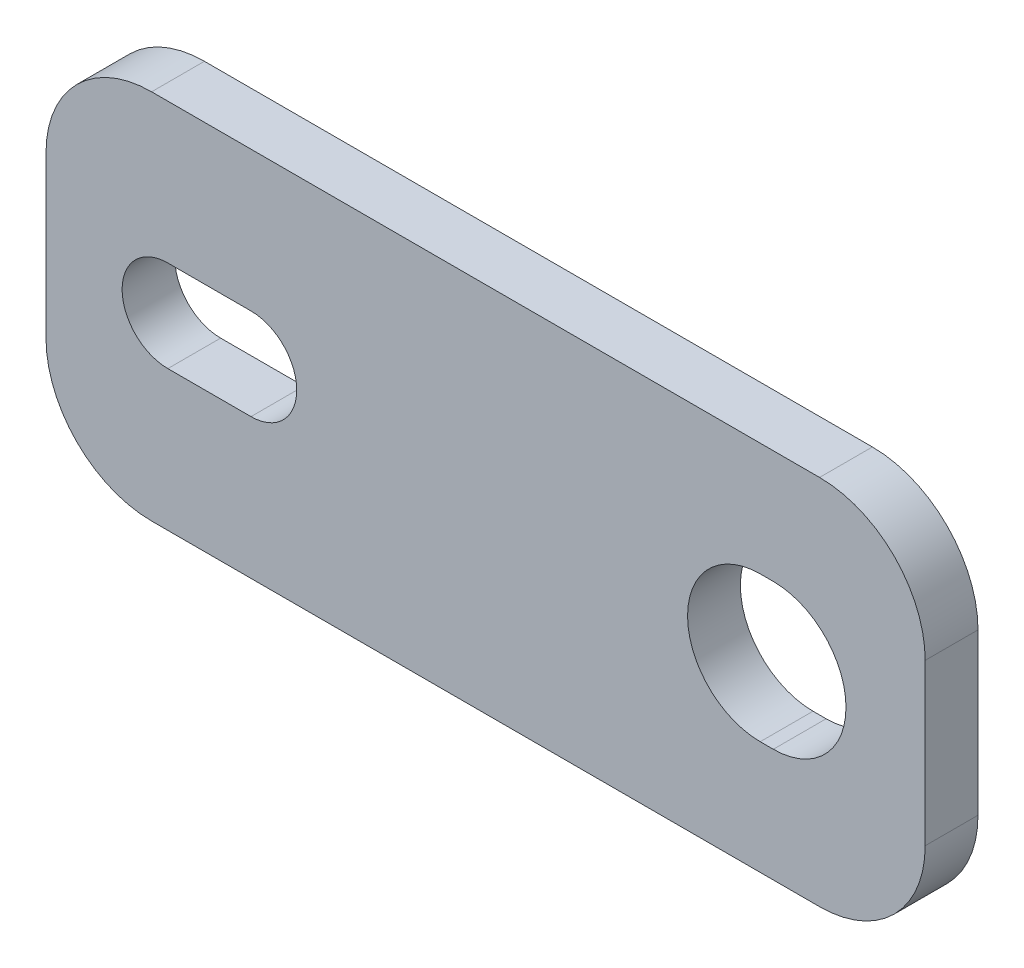
ISO-10303-21;
HEADER;
FILE_DESCRIPTION(('STEP AP214'),'2;1');
FILE_NAME('part.step','',(''),(''),'','','');
FILE_SCHEMA(('AUTOMOTIVE_DESIGN { 1 0 10303 214 1 1 1 1 }'));
ENDSEC;
DATA;
#1=APPLICATION_CONTEXT('core data for automotive mechanical design processes');
#2=APPLICATION_PROTOCOL_DEFINITION('international standard','automotive_design',2000,#1);
#3=PRODUCT_CONTEXT('',#1,'mechanical');
#4=PRODUCT('Part','Part','',(#3));
#5=PRODUCT_RELATED_PRODUCT_CATEGORY('part','',(#4));
#6=PRODUCT_DEFINITION_FORMATION('','',#4);
#7=PRODUCT_DEFINITION_CONTEXT('part definition',#1,'design');
#8=PRODUCT_DEFINITION('design','',#6,#7);
#9=PRODUCT_DEFINITION_SHAPE('','',#8);
#10=(LENGTH_UNIT() NAMED_UNIT(*) SI_UNIT(.MILLI.,.METRE.));
#11=(NAMED_UNIT(*) PLANE_ANGLE_UNIT() SI_UNIT($,.RADIAN.));
#12=(NAMED_UNIT(*) SI_UNIT($,.STERADIAN.) SOLID_ANGLE_UNIT());
#13=UNCERTAINTY_MEASURE_WITH_UNIT(LENGTH_MEASURE(1.E-05),#10,'distance_accuracy_value','');
#14=(GEOMETRIC_REPRESENTATION_CONTEXT(3) GLOBAL_UNCERTAINTY_ASSIGNED_CONTEXT((#13)) GLOBAL_UNIT_ASSIGNED_CONTEXT((#10,
#11,#12)) REPRESENTATION_CONTEXT('',''));
#15=CARTESIAN_POINT('',(0.,0.,0.));
#16=DIRECTION('',(0.,0.,1.));
#17=DIRECTION('',(1.,0.,0.));
#18=AXIS2_PLACEMENT_3D('',#15,#16,#17);
#19=CARTESIAN_POINT('',(0.,0.,-3.175));
#20=DIRECTION('',(0.,0.,-1.));
#21=DIRECTION('',(-1.,0.,0.));
#22=AXIS2_PLACEMENT_3D('',#19,#20,#21);
#23=PLANE('',#22);
#24=DIRECTION('',(1.,0.,0.));
#25=VECTOR('',#24,1.);
#26=CARTESIAN_POINT('',(0.,6.80719999999018,-3.175));
#27=LINE('',#26,#25);
#28=CARTESIAN_POINT('',(42.9436999999572,6.80719999999013,-3.175));
#29=VERTEX_POINT('',#28);
#30=CARTESIAN_POINT('',(43.7310999999572,6.80719999999013,-3.175));
#31=VERTEX_POINT('',#30);
#32=EDGE_CURVE('E195',#29,#31,#27,.T.);
#33=ORIENTED_EDGE('',*,*,#32,.T.);
#34=CARTESIAN_POINT('',(43.7310999999572,11.1759999999901,-3.175));
#35=DIRECTION('',(0.,0.,1.));
#36=DIRECTION('',(1.,0.,0.));
#37=AXIS2_PLACEMENT_3D('',#34,#35,#36);
#38=CIRCLE('',#37,4.3688);
#39=CARTESIAN_POINT('',(43.7310999999572,15.5447999999901,-3.175));
#40=VERTEX_POINT('',#39);
#41=EDGE_CURVE('E198',#31,#40,#38,.T.);
#42=ORIENTED_EDGE('',*,*,#41,.T.);
#43=DIRECTION('',(-1.,0.,0.));
#44=VECTOR('',#43,1.);
#45=CARTESIAN_POINT('',(1.02740396835208E-13,15.5447999999904,-3.175));
#46=LINE('',#45,#44);
#47=CARTESIAN_POINT('',(42.9436999999572,15.5447999999901,-3.175));
#48=VERTEX_POINT('',#47);
#49=EDGE_CURVE('E202',#40,#48,#46,.T.);
#50=ORIENTED_EDGE('',*,*,#49,.T.);
#51=CARTESIAN_POINT('',(42.9436999999572,11.1759999999901,-3.175));
#52=DIRECTION('',(0.,0.,1.));
#53=DIRECTION('',(1.,0.,0.));
#54=AXIS2_PLACEMENT_3D('',#51,#52,#53);
#55=CIRCLE('',#54,4.3688);
#56=EDGE_CURVE('E205',#48,#29,#55,.T.);
#57=ORIENTED_EDGE('',*,*,#56,.T.);
#58=EDGE_LOOP('',(#33,#42,#50,#57));
#59=FACE_BOUND('',#58,.T.);
#60=DIRECTION('',(-1.,0.,0.));
#61=VECTOR('',#60,1.);
#62=CARTESIAN_POINT('',(0.,22.352,-3.175));
#63=LINE('',#62,#61);
#64=CARTESIAN_POINT('',(46.5123999999572,22.352,-3.175));
#65=VERTEX_POINT('',#64);
#66=CARTESIAN_POINT('',(6.35,22.352,-3.175));
#67=VERTEX_POINT('',#66);
#68=EDGE_CURVE('E235',#65,#67,#63,.T.);
#69=ORIENTED_EDGE('',*,*,#68,.F.);
#70=CARTESIAN_POINT('',(46.5123999999572,16.002,-3.175));
#71=DIRECTION('',(0.,0.,-1.));
#72=DIRECTION('',(-1.,0.,0.));
#73=AXIS2_PLACEMENT_3D('',#70,#71,#72);
#74=CIRCLE('',#73,6.35);
#75=CARTESIAN_POINT('',(52.8623999999572,16.002,-3.175));
#76=VERTEX_POINT('',#75);
#77=EDGE_CURVE('E271',#65,#76,#74,.T.);
#78=ORIENTED_EDGE('',*,*,#77,.T.);
#79=DIRECTION('',(0.,1.,0.));
#80=VECTOR('',#79,1.);
#81=CARTESIAN_POINT('',(52.8623999999572,0.,-3.175));
#82=LINE('',#81,#80);
#83=CARTESIAN_POINT('',(52.8623999999572,6.35,-3.175));
#84=VERTEX_POINT('',#83);
#85=EDGE_CURVE('E232',#84,#76,#82,.T.);
#86=ORIENTED_EDGE('',*,*,#85,.F.);
#87=CARTESIAN_POINT('',(46.5123999999572,6.35,-3.175));
#88=DIRECTION('',(0.,0.,-1.));
#89=DIRECTION('',(-1.,0.,0.));
#90=AXIS2_PLACEMENT_3D('',#87,#88,#89);
#91=CIRCLE('',#90,6.35);
#92=CARTESIAN_POINT('',(46.5123999999572,0.,-3.175));
#93=VERTEX_POINT('',#92);
#94=EDGE_CURVE('E53',#84,#93,#91,.T.);
#95=ORIENTED_EDGE('',*,*,#94,.T.);
#96=DIRECTION('',(1.,0.,0.));
#97=VECTOR('',#96,1.);
#98=CARTESIAN_POINT('',(0.,0.,-3.175));
#99=LINE('',#98,#97);
#100=CARTESIAN_POINT('',(6.35,0.,-3.175));
#101=VERTEX_POINT('',#100);
#102=EDGE_CURVE('E229',#101,#93,#99,.T.);
#103=ORIENTED_EDGE('',*,*,#102,.F.);
#104=CARTESIAN_POINT('',(6.35,6.35,-3.175));
#105=DIRECTION('',(0.,0.,-1.));
#106=DIRECTION('',(-1.,0.,0.));
#107=AXIS2_PLACEMENT_3D('',#104,#105,#106);
#108=CIRCLE('',#107,6.35);
#109=CARTESIAN_POINT('',(0.,6.35,-3.175));
#110=VERTEX_POINT('',#109);
#111=EDGE_CURVE('E266',#101,#110,#108,.T.);
#112=ORIENTED_EDGE('',*,*,#111,.T.);
#113=DIRECTION('',(0.,-1.,0.));
#114=VECTOR('',#113,1.);
#115=CARTESIAN_POINT('',(0.,0.,-3.175));
#116=LINE('',#115,#114);
#117=CARTESIAN_POINT('',(0.,16.002,-3.175));
#118=VERTEX_POINT('',#117);
#119=EDGE_CURVE('E226',#118,#110,#116,.T.);
#120=ORIENTED_EDGE('',*,*,#119,.F.);
#121=CARTESIAN_POINT('',(6.35,16.002,-3.175));
#122=DIRECTION('',(0.,0.,-1.));
#123=DIRECTION('',(-1.,0.,0.));
#124=AXIS2_PLACEMENT_3D('',#121,#122,#123);
#125=CIRCLE('',#124,6.35);
#126=EDGE_CURVE('E268',#118,#67,#125,.T.);
#127=ORIENTED_EDGE('',*,*,#126,.T.);
#128=EDGE_LOOP('',(#69,#78,#86,#95,#103,#112,#120,#127));
#129=FACE_BOUND('',#128,.T.);
#130=CARTESIAN_POINT('',(12.3250000000016,11.1759999999985,-3.175));
#131=DIRECTION('',(0.,0.,1.));
#132=DIRECTION('',(1.,0.,0.));
#133=AXIS2_PLACEMENT_3D('',#130,#131,#132);
#134=CIRCLE('',#133,2.75);
#135=CARTESIAN_POINT('',(12.3250000000016,8.42599999999846,-3.175));
#136=VERTEX_POINT('',#135);
#137=CARTESIAN_POINT('',(12.3250000000016,13.9259999999985,-3.175));
#138=VERTEX_POINT('',#137);
#139=EDGE_CURVE('E163',#136,#138,#134,.T.);
#140=ORIENTED_EDGE('',*,*,#139,.T.);
#141=DIRECTION('',(1.,0.,0.));
#142=VECTOR('',#141,1.);
#143=CARTESIAN_POINT('',(0.,13.9259999999985,-3.175));
#144=LINE('',#143,#142);
#145=CARTESIAN_POINT('',(7.32500000000163,13.9259999999985,-3.175));
#146=VERTEX_POINT('',#145);
#147=EDGE_CURVE('E155',#146,#138,#144,.T.);
#148=ORIENTED_EDGE('',*,*,#147,.F.);
#149=CARTESIAN_POINT('',(7.32500000000165,11.1759999999985,-3.175));
#150=DIRECTION('',(0.,0.,1.));
#151=DIRECTION('',(1.,0.,0.));
#152=AXIS2_PLACEMENT_3D('',#149,#150,#151);
#153=CIRCLE('',#152,2.75);
#154=CARTESIAN_POINT('',(7.32500000000163,8.42599999999846,-3.175));
#155=VERTEX_POINT('',#154);
#156=EDGE_CURVE('E166',#146,#155,#153,.T.);
#157=ORIENTED_EDGE('',*,*,#156,.T.);
#158=DIRECTION('',(-1.,0.,0.));
#159=VECTOR('',#158,1.);
#160=CARTESIAN_POINT('',(0.,8.42599999999846,-3.175));
#161=LINE('',#160,#159);
#162=EDGE_CURVE('E171',#136,#155,#161,.T.);
#163=ORIENTED_EDGE('',*,*,#162,.F.);
#164=EDGE_LOOP('',(#140,#148,#157,#163));
#165=FACE_BOUND('',#164,.T.);
#166=ADVANCED_FACE('F38',(#59,#129,#165),#23,.T.);
#167=CARTESIAN_POINT('',(0.,0.,0.));
#168=DIRECTION('',(0.,0.,-1.));
#169=DIRECTION('',(-1.,0.,0.));
#170=AXIS2_PLACEMENT_3D('',#167,#168,#169);
#171=PLANE('',#170);
#172=DIRECTION('',(0.,1.,0.));
#173=VECTOR('',#172,1.);
#174=CARTESIAN_POINT('',(52.8623999999572,0.,0.));
#175=LINE('',#174,#173);
#176=CARTESIAN_POINT('',(52.8623999999572,6.35,0.));
#177=VERTEX_POINT('',#176);
#178=CARTESIAN_POINT('',(52.8623999999572,16.002,0.));
#179=VERTEX_POINT('',#178);
#180=EDGE_CURVE('E244',#177,#179,#175,.T.);
#181=ORIENTED_EDGE('',*,*,#180,.T.);
#182=CARTESIAN_POINT('',(46.5123999999572,16.002,0.));
#183=DIRECTION('',(0.,0.,-1.));
#184=DIRECTION('',(-1.,0.,0.));
#185=AXIS2_PLACEMENT_3D('',#182,#183,#184);
#186=CIRCLE('',#185,6.35);
#187=CARTESIAN_POINT('',(46.5123999999572,22.352,0.));
#188=VERTEX_POINT('',#187);
#189=EDGE_CURVE('E259',#179,#188,#186,.F.);
#190=ORIENTED_EDGE('',*,*,#189,.T.);
#191=DIRECTION('',(-1.,0.,0.));
#192=VECTOR('',#191,1.);
#193=CARTESIAN_POINT('',(0.,22.352,0.));
#194=LINE('',#193,#192);
#195=CARTESIAN_POINT('',(6.35,22.352,0.));
#196=VERTEX_POINT('',#195);
#197=EDGE_CURVE('E230',#188,#196,#194,.T.);
#198=ORIENTED_EDGE('',*,*,#197,.T.);
#199=CARTESIAN_POINT('',(6.35,16.002,0.));
#200=DIRECTION('',(0.,0.,-1.));
#201=DIRECTION('',(-1.,0.,0.));
#202=AXIS2_PLACEMENT_3D('',#199,#200,#201);
#203=CIRCLE('',#202,6.35);
#204=CARTESIAN_POINT('',(0.,16.002,0.));
#205=VERTEX_POINT('',#204);
#206=EDGE_CURVE('E255',#196,#205,#203,.F.);
#207=ORIENTED_EDGE('',*,*,#206,.T.);
#208=DIRECTION('',(0.,-1.,0.));
#209=VECTOR('',#208,1.);
#210=CARTESIAN_POINT('',(0.,0.,0.));
#211=LINE('',#210,#209);
#212=CARTESIAN_POINT('',(0.,6.35,0.));
#213=VERTEX_POINT('',#212);
#214=EDGE_CURVE('E191',#205,#213,#211,.T.);
#215=ORIENTED_EDGE('',*,*,#214,.T.);
#216=CARTESIAN_POINT('',(6.35,6.35,0.));
#217=DIRECTION('',(0.,0.,-1.));
#218=DIRECTION('',(-1.,0.,0.));
#219=AXIS2_PLACEMENT_3D('',#216,#217,#218);
#220=CIRCLE('',#219,6.35);
#221=CARTESIAN_POINT('',(6.35,0.,0.));
#222=VERTEX_POINT('',#221);
#223=EDGE_CURVE('E253',#213,#222,#220,.F.);
#224=ORIENTED_EDGE('',*,*,#223,.T.);
#225=DIRECTION('',(1.,0.,0.));
#226=VECTOR('',#225,1.);
#227=CARTESIAN_POINT('',(0.,0.,0.));
#228=LINE('',#227,#226);
#229=CARTESIAN_POINT('',(46.5123999999572,0.,0.));
#230=VERTEX_POINT('',#229);
#231=EDGE_CURVE('E241',#222,#230,#228,.T.);
#232=ORIENTED_EDGE('',*,*,#231,.T.);
#233=CARTESIAN_POINT('',(46.5123999999572,6.35,0.));
#234=DIRECTION('',(0.,0.,-1.));
#235=DIRECTION('',(-1.,0.,0.));
#236=AXIS2_PLACEMENT_3D('',#233,#234,#235);
#237=CIRCLE('',#236,6.35);
#238=EDGE_CURVE('E257',#230,#177,#237,.F.);
#239=ORIENTED_EDGE('',*,*,#238,.T.);
#240=EDGE_LOOP('',(#181,#190,#198,#207,#215,#224,#232,#239));
#241=FACE_BOUND('',#240,.T.);
#242=CARTESIAN_POINT('',(43.7310999999572,11.1759999999901,0.));
#243=DIRECTION('',(0.,0.,1.));
#244=DIRECTION('',(1.,0.,0.));
#245=AXIS2_PLACEMENT_3D('',#242,#243,#244);
#246=CIRCLE('',#245,4.3688);
#247=CARTESIAN_POINT('',(43.7310999999572,6.80719999999014,0.));
#248=VERTEX_POINT('',#247);
#249=CARTESIAN_POINT('',(43.7310999999572,15.5447999999901,0.));
#250=VERTEX_POINT('',#249);
#251=EDGE_CURVE('E211',#248,#250,#246,.T.);
#252=ORIENTED_EDGE('',*,*,#251,.F.);
#253=DIRECTION('',(1.,0.,0.));
#254=VECTOR('',#253,1.);
#255=CARTESIAN_POINT('',(0.,6.80719999999018,0.));
#256=LINE('',#255,#254);
#257=CARTESIAN_POINT('',(42.9436999999572,6.80719999999013,0.));
#258=VERTEX_POINT('',#257);
#259=EDGE_CURVE('E209',#258,#248,#256,.T.);
#260=ORIENTED_EDGE('',*,*,#259,.F.);
#261=CARTESIAN_POINT('',(42.9436999999572,11.1759999999901,0.));
#262=DIRECTION('',(0.,0.,1.));
#263=DIRECTION('',(1.,0.,0.));
#264=AXIS2_PLACEMENT_3D('',#261,#262,#263);
#265=CIRCLE('',#264,4.3688);
#266=CARTESIAN_POINT('',(42.9436999999572,15.5447999999901,0.));
#267=VERTEX_POINT('',#266);
#268=EDGE_CURVE('E199',#267,#258,#265,.T.);
#269=ORIENTED_EDGE('',*,*,#268,.F.);
#270=DIRECTION('',(-1.,0.,0.));
#271=VECTOR('',#270,1.);
#272=CARTESIAN_POINT('',(1.02740396835208E-13,15.5447999999904,0.));
#273=LINE('',#272,#271);
#274=EDGE_CURVE('E214',#250,#267,#273,.T.);
#275=ORIENTED_EDGE('',*,*,#274,.F.);
#276=EDGE_LOOP('',(#252,#260,#269,#275));
#277=FACE_BOUND('',#276,.T.);
#278=DIRECTION('',(1.,0.,0.));
#279=VECTOR('',#278,1.);
#280=CARTESIAN_POINT('',(0.,13.9259999999985,0.));
#281=LINE('',#280,#279);
#282=CARTESIAN_POINT('',(7.32500000000163,13.9259999999985,0.));
#283=VERTEX_POINT('',#282);
#284=CARTESIAN_POINT('',(12.3250000000016,13.9259999999985,0.));
#285=VERTEX_POINT('',#284);
#286=EDGE_CURVE('E158',#283,#285,#281,.T.);
#287=ORIENTED_EDGE('',*,*,#286,.T.);
#288=CARTESIAN_POINT('',(12.3250000000016,11.1759999999985,0.));
#289=DIRECTION('',(0.,0.,1.));
#290=DIRECTION('',(1.,0.,0.));
#291=AXIS2_PLACEMENT_3D('',#288,#289,#290);
#292=CIRCLE('',#291,2.75);
#293=CARTESIAN_POINT('',(12.3250000000016,8.42599999999846,0.));
#294=VERTEX_POINT('',#293);
#295=EDGE_CURVE('E175',#294,#285,#292,.T.);
#296=ORIENTED_EDGE('',*,*,#295,.F.);
#297=DIRECTION('',(-1.,0.,0.));
#298=VECTOR('',#297,1.);
#299=CARTESIAN_POINT('',(0.,8.42599999999846,0.));
#300=LINE('',#299,#298);
#301=CARTESIAN_POINT('',(7.32500000000163,8.42599999999846,0.));
#302=VERTEX_POINT('',#301);
#303=EDGE_CURVE('E178',#294,#302,#300,.T.);
#304=ORIENTED_EDGE('',*,*,#303,.T.);
#305=CARTESIAN_POINT('',(7.32500000000165,11.1759999999985,0.));
#306=DIRECTION('',(0.,0.,1.));
#307=DIRECTION('',(1.,0.,0.));
#308=AXIS2_PLACEMENT_3D('',#305,#306,#307);
#309=CIRCLE('',#308,2.75);
#310=EDGE_CURVE('E184',#283,#302,#309,.T.);
#311=ORIENTED_EDGE('',*,*,#310,.F.);
#312=EDGE_LOOP('',(#287,#296,#304,#311));
#313=FACE_BOUND('',#312,.T.);
#314=ADVANCED_FACE('F286',(#241,#277,#313),#171,.F.);
#315=CARTESIAN_POINT('',(0.,0.,-3.175));
#316=DIRECTION('',(-1.,0.,0.));
#317=DIRECTION('',(0.,0.,1.));
#318=AXIS2_PLACEMENT_3D('',#315,#316,#317);
#319=PLANE('',#318);
#320=ORIENTED_EDGE('',*,*,#214,.F.);
#321=DIRECTION('',(0.,0.,1.));
#322=VECTOR('',#321,1.);
#323=CARTESIAN_POINT('',(0.,16.002,-3.175));
#324=LINE('',#323,#322);
#325=EDGE_CURVE('E11',#205,#118,#324,.F.);
#326=ORIENTED_EDGE('',*,*,#325,.T.);
#327=ORIENTED_EDGE('',*,*,#119,.T.);
#328=DIRECTION('',(0.,0.,1.));
#329=VECTOR('',#328,1.);
#330=CARTESIAN_POINT('',(0.,6.35,-3.175));
#331=LINE('',#330,#329);
#332=EDGE_CURVE('E46',#110,#213,#331,.T.);
#333=ORIENTED_EDGE('',*,*,#332,.T.);
#334=EDGE_LOOP('',(#320,#326,#327,#333));
#335=FACE_BOUND('',#334,.T.);
#336=ADVANCED_FACE('F280',(#335),#319,.T.);
#337=CARTESIAN_POINT('',(0.,22.352,-3.175));
#338=DIRECTION('',(0.,1.,0.));
#339=DIRECTION('',(0.,0.,1.));
#340=AXIS2_PLACEMENT_3D('',#337,#338,#339);
#341=PLANE('',#340);
#342=ORIENTED_EDGE('',*,*,#197,.F.);
#343=DIRECTION('',(0.,0.,1.));
#344=VECTOR('',#343,1.);
#345=CARTESIAN_POINT('',(46.5123999999572,22.352,-3.175));
#346=LINE('',#345,#344);
#347=EDGE_CURVE('E264',#188,#65,#346,.F.);
#348=ORIENTED_EDGE('',*,*,#347,.T.);
#349=ORIENTED_EDGE('',*,*,#68,.T.);
#350=DIRECTION('',(0.,0.,1.));
#351=VECTOR('',#350,1.);
#352=CARTESIAN_POINT('',(6.35,22.352,-3.175));
#353=LINE('',#352,#351);
#354=EDGE_CURVE('E261',#67,#196,#353,.T.);
#355=ORIENTED_EDGE('',*,*,#354,.T.);
#356=EDGE_LOOP('',(#342,#348,#349,#355));
#357=FACE_BOUND('',#356,.T.);
#358=ADVANCED_FACE('F294',(#357),#341,.T.);
#359=CARTESIAN_POINT('',(52.8623999999572,0.,-3.175));
#360=DIRECTION('',(1.,0.,0.));
#361=DIRECTION('',(0.,0.,-1.));
#362=AXIS2_PLACEMENT_3D('',#359,#360,#361);
#363=PLANE('',#362);
#364=ORIENTED_EDGE('',*,*,#85,.T.);
#365=DIRECTION('',(0.,0.,1.));
#366=VECTOR('',#365,1.);
#367=CARTESIAN_POINT('',(52.8623999999572,16.002,-3.175));
#368=LINE('',#367,#366);
#369=EDGE_CURVE('E250',#76,#179,#368,.T.);
#370=ORIENTED_EDGE('',*,*,#369,.T.);
#371=ORIENTED_EDGE('',*,*,#180,.F.);
#372=DIRECTION('',(0.,0.,1.));
#373=VECTOR('',#372,1.);
#374=CARTESIAN_POINT('',(52.8623999999572,6.35,-3.175));
#375=LINE('',#374,#373);
#376=EDGE_CURVE('E238',#177,#84,#375,.F.);
#377=ORIENTED_EDGE('',*,*,#376,.T.);
#378=EDGE_LOOP('',(#364,#370,#371,#377));
#379=FACE_BOUND('',#378,.T.);
#380=ADVANCED_FACE('F303',(#379),#363,.T.);
#381=CARTESIAN_POINT('',(0.,0.,-3.175));
#382=DIRECTION('',(0.,-1.,0.));
#383=DIRECTION('',(0.,0.,-1.));
#384=AXIS2_PLACEMENT_3D('',#381,#382,#383);
#385=PLANE('',#384);
#386=ORIENTED_EDGE('',*,*,#102,.T.);
#387=DIRECTION('',(0.,0.,1.));
#388=VECTOR('',#387,1.);
#389=CARTESIAN_POINT('',(46.5123999999572,0.,-3.175));
#390=LINE('',#389,#388);
#391=EDGE_CURVE('E274',#93,#230,#390,.T.);
#392=ORIENTED_EDGE('',*,*,#391,.T.);
#393=ORIENTED_EDGE('',*,*,#231,.F.);
#394=DIRECTION('',(0.,0.,1.));
#395=VECTOR('',#394,1.);
#396=CARTESIAN_POINT('',(6.35,0.,-3.175));
#397=LINE('',#396,#395);
#398=EDGE_CURVE('E60',#222,#101,#397,.F.);
#399=ORIENTED_EDGE('',*,*,#398,.T.);
#400=EDGE_LOOP('',(#386,#392,#393,#399));
#401=FACE_BOUND('',#400,.T.);
#402=ADVANCED_FACE('F308',(#401),#385,.T.);
#403=CARTESIAN_POINT('',(0.,6.80719999999018,-3.175));
#404=DIRECTION('',(0.,-1.,0.));
#405=DIRECTION('',(1.,0.,0.));
#406=AXIS2_PLACEMENT_3D('',#403,#404,#405);
#407=PLANE('',#406);
#408=ORIENTED_EDGE('',*,*,#259,.T.);
#409=DIRECTION('',(0.,0.,1.));
#410=VECTOR('',#409,1.);
#411=CARTESIAN_POINT('',(43.7310999999572,6.80719999999013,-3.175));
#412=LINE('',#411,#410);
#413=EDGE_CURVE('E208',#31,#248,#412,.T.);
#414=ORIENTED_EDGE('',*,*,#413,.F.);
#415=ORIENTED_EDGE('',*,*,#32,.F.);
#416=DIRECTION('',(0.,0.,1.));
#417=VECTOR('',#416,1.);
#418=CARTESIAN_POINT('',(42.9436999999572,6.80719999999013,-3.175));
#419=LINE('',#418,#417);
#420=EDGE_CURVE('E185',#29,#258,#419,.T.);
#421=ORIENTED_EDGE('',*,*,#420,.T.);
#422=EDGE_LOOP('',(#408,#414,#415,#421));
#423=FACE_BOUND('',#422,.T.);
#424=ADVANCED_FACE('F321',(#423),#407,.F.);
#425=CARTESIAN_POINT('',(42.9436999999572,11.1759999999901,-3.175));
#426=DIRECTION('',(0.,0.,1.));
#427=DIRECTION('',(1.,0.,0.));
#428=AXIS2_PLACEMENT_3D('',#425,#426,#427);
#429=CYLINDRICAL_SURFACE('',#428,4.3688);
#430=ORIENTED_EDGE('',*,*,#268,.T.);
#431=ORIENTED_EDGE('',*,*,#420,.F.);
#432=ORIENTED_EDGE('',*,*,#56,.F.);
#433=DIRECTION('',(0.,0.,1.));
#434=VECTOR('',#433,1.);
#435=CARTESIAN_POINT('',(42.9436999999572,15.5447999999901,-3.175));
#436=LINE('',#435,#434);
#437=EDGE_CURVE('E220',#48,#267,#436,.T.);
#438=ORIENTED_EDGE('',*,*,#437,.T.);
#439=EDGE_LOOP('',(#430,#431,#432,#438));
#440=FACE_BOUND('',#439,.T.);
#441=ADVANCED_FACE('F416',(#440),#429,.F.);
#442=CARTESIAN_POINT('',(1.02740396835208E-13,15.5447999999904,-3.175));
#443=DIRECTION('',(0.,1.,0.));
#444=DIRECTION('',(-1.,0.,0.));
#445=AXIS2_PLACEMENT_3D('',#442,#443,#444);
#446=PLANE('',#445);
#447=ORIENTED_EDGE('',*,*,#274,.T.);
#448=ORIENTED_EDGE('',*,*,#437,.F.);
#449=ORIENTED_EDGE('',*,*,#49,.F.);
#450=DIRECTION('',(0.,0.,1.));
#451=VECTOR('',#450,1.);
#452=CARTESIAN_POINT('',(43.7310999999572,15.5447999999901,-3.175));
#453=LINE('',#452,#451);
#454=EDGE_CURVE('E222',#40,#250,#453,.T.);
#455=ORIENTED_EDGE('',*,*,#454,.T.);
#456=EDGE_LOOP('',(#447,#448,#449,#455));
#457=FACE_BOUND('',#456,.T.);
#458=ADVANCED_FACE('F406',(#457),#446,.F.);
#459=CARTESIAN_POINT('',(43.7310999999572,11.1759999999901,-3.175));
#460=DIRECTION('',(0.,0.,1.));
#461=DIRECTION('',(1.,0.,0.));
#462=AXIS2_PLACEMENT_3D('',#459,#460,#461);
#463=CYLINDRICAL_SURFACE('',#462,4.3688);
#464=ORIENTED_EDGE('',*,*,#251,.T.);
#465=ORIENTED_EDGE('',*,*,#454,.F.);
#466=ORIENTED_EDGE('',*,*,#41,.F.);
#467=ORIENTED_EDGE('',*,*,#413,.T.);
#468=EDGE_LOOP('',(#464,#465,#466,#467));
#469=FACE_BOUND('',#468,.T.);
#470=ADVANCED_FACE('F396',(#469),#463,.F.);
#471=CARTESIAN_POINT('',(0.,13.9259999999985,-3.175));
#472=DIRECTION('',(0.,-1.,0.));
#473=DIRECTION('',(0.,0.,-1.));
#474=AXIS2_PLACEMENT_3D('',#471,#472,#473);
#475=PLANE('',#474);
#476=ORIENTED_EDGE('',*,*,#286,.F.);
#477=DIRECTION('',(0.,0.,1.));
#478=VECTOR('',#477,1.);
#479=CARTESIAN_POINT('',(7.32500000000163,13.9259999999985,-3.175));
#480=LINE('',#479,#478);
#481=EDGE_CURVE('E151',#146,#283,#480,.T.);
#482=ORIENTED_EDGE('',*,*,#481,.F.);
#483=ORIENTED_EDGE('',*,*,#147,.T.);
#484=DIRECTION('',(0.,0.,1.));
#485=VECTOR('',#484,1.);
#486=CARTESIAN_POINT('',(12.3250000000016,13.9259999999985,-3.175));
#487=LINE('',#486,#485);
#488=EDGE_CURVE('E189',#138,#285,#487,.T.);
#489=ORIENTED_EDGE('',*,*,#488,.T.);
#490=EDGE_LOOP('',(#476,#482,#483,#489));
#491=FACE_BOUND('',#490,.T.);
#492=ADVANCED_FACE('F153',(#491),#475,.T.);
#493=CARTESIAN_POINT('',(12.3250000000016,11.1759999999985,-3.175));
#494=DIRECTION('',(0.,0.,1.));
#495=DIRECTION('',(1.,0.,0.));
#496=AXIS2_PLACEMENT_3D('',#493,#494,#495);
#497=CYLINDRICAL_SURFACE('',#496,2.75);
#498=ORIENTED_EDGE('',*,*,#295,.T.);
#499=ORIENTED_EDGE('',*,*,#488,.F.);
#500=ORIENTED_EDGE('',*,*,#139,.F.);
#501=DIRECTION('',(0.,0.,1.));
#502=VECTOR('',#501,1.);
#503=CARTESIAN_POINT('',(12.3250000000016,8.42599999999846,-3.175));
#504=LINE('',#503,#502);
#505=EDGE_CURVE('E192',#136,#294,#504,.T.);
#506=ORIENTED_EDGE('',*,*,#505,.T.);
#507=EDGE_LOOP('',(#498,#499,#500,#506));
#508=FACE_BOUND('',#507,.T.);
#509=ADVANCED_FACE('F375',(#508),#497,.F.);
#510=CARTESIAN_POINT('',(0.,8.42599999999846,-3.175));
#511=DIRECTION('',(0.,1.,0.));
#512=DIRECTION('',(0.,0.,1.));
#513=AXIS2_PLACEMENT_3D('',#510,#511,#512);
#514=PLANE('',#513);
#515=ORIENTED_EDGE('',*,*,#303,.F.);
#516=ORIENTED_EDGE('',*,*,#505,.F.);
#517=ORIENTED_EDGE('',*,*,#162,.T.);
#518=DIRECTION('',(0.,0.,1.));
#519=VECTOR('',#518,1.);
#520=CARTESIAN_POINT('',(7.32500000000163,8.42599999999846,-3.175));
#521=LINE('',#520,#519);
#522=EDGE_CURVE('E162',#155,#302,#521,.T.);
#523=ORIENTED_EDGE('',*,*,#522,.T.);
#524=EDGE_LOOP('',(#515,#516,#517,#523));
#525=FACE_BOUND('',#524,.T.);
#526=ADVANCED_FACE('F365',(#525),#514,.T.);
#527=CARTESIAN_POINT('',(7.32500000000165,11.1759999999985,-3.175));
#528=DIRECTION('',(0.,0.,1.));
#529=DIRECTION('',(1.,0.,0.));
#530=AXIS2_PLACEMENT_3D('',#527,#528,#529);
#531=CYLINDRICAL_SURFACE('',#530,2.75);
#532=ORIENTED_EDGE('',*,*,#310,.T.);
#533=ORIENTED_EDGE('',*,*,#522,.F.);
#534=ORIENTED_EDGE('',*,*,#156,.F.);
#535=ORIENTED_EDGE('',*,*,#481,.T.);
#536=EDGE_LOOP('',(#532,#533,#534,#535));
#537=FACE_BOUND('',#536,.T.);
#538=ADVANCED_FACE('F167',(#537),#531,.F.);
#539=CARTESIAN_POINT('',(46.5123999999572,16.002,-3.175));
#540=DIRECTION('',(0.,0.,1.));
#541=DIRECTION('',(1.,0.,0.));
#542=AXIS2_PLACEMENT_3D('',#539,#540,#541);
#543=CYLINDRICAL_SURFACE('',#542,6.35);
#544=ORIENTED_EDGE('',*,*,#77,.F.);
#545=ORIENTED_EDGE('',*,*,#347,.F.);
#546=ORIENTED_EDGE('',*,*,#189,.F.);
#547=ORIENTED_EDGE('',*,*,#369,.F.);
#548=EDGE_LOOP('',(#544,#545,#546,#547));
#549=FACE_BOUND('',#548,.T.);
#550=ADVANCED_FACE('F300',(#549),#543,.T.);
#551=CARTESIAN_POINT('',(46.5123999999572,6.35,-3.175));
#552=DIRECTION('',(0.,0.,1.));
#553=DIRECTION('',(1.,0.,0.));
#554=AXIS2_PLACEMENT_3D('',#551,#552,#553);
#555=CYLINDRICAL_SURFACE('',#554,6.35);
#556=ORIENTED_EDGE('',*,*,#94,.F.);
#557=ORIENTED_EDGE('',*,*,#376,.F.);
#558=ORIENTED_EDGE('',*,*,#238,.F.);
#559=ORIENTED_EDGE('',*,*,#391,.F.);
#560=EDGE_LOOP('',(#556,#557,#558,#559));
#561=FACE_BOUND('',#560,.T.);
#562=ADVANCED_FACE('F307',(#561),#555,.T.);
#563=CARTESIAN_POINT('',(6.35,16.002,-3.175));
#564=DIRECTION('',(0.,0.,1.));
#565=DIRECTION('',(1.,0.,0.));
#566=AXIS2_PLACEMENT_3D('',#563,#564,#565);
#567=CYLINDRICAL_SURFACE('',#566,6.35);
#568=ORIENTED_EDGE('',*,*,#126,.F.);
#569=ORIENTED_EDGE('',*,*,#325,.F.);
#570=ORIENTED_EDGE('',*,*,#206,.F.);
#571=ORIENTED_EDGE('',*,*,#354,.F.);
#572=EDGE_LOOP('',(#568,#569,#570,#571));
#573=FACE_BOUND('',#572,.T.);
#574=ADVANCED_FACE('F292',(#573),#567,.T.);
#575=CARTESIAN_POINT('',(6.35,6.35,-3.175));
#576=DIRECTION('',(0.,0.,1.));
#577=DIRECTION('',(1.,0.,0.));
#578=AXIS2_PLACEMENT_3D('',#575,#576,#577);
#579=CYLINDRICAL_SURFACE('',#578,6.35);
#580=ORIENTED_EDGE('',*,*,#111,.F.);
#581=ORIENTED_EDGE('',*,*,#398,.F.);
#582=ORIENTED_EDGE('',*,*,#223,.F.);
#583=ORIENTED_EDGE('',*,*,#332,.F.);
#584=EDGE_LOOP('',(#580,#581,#582,#583));
#585=FACE_BOUND('',#584,.T.);
#586=ADVANCED_FACE('F40',(#585),#579,.T.);
#587=CLOSED_SHELL('',(#166,#314,#336,#358,#380,#402,#424,#441,#458,#470,#492,#509,#526,#538,
#550,#562,#574,#586));
#588=MANIFOLD_SOLID_BREP('B2',#587);
#589=ADVANCED_BREP_SHAPE_REPRESENTATION('',(#18,#588),#14);
#590=SHAPE_DEFINITION_REPRESENTATION(#9,#589);
ENDSEC;
END-ISO-10303-21;
